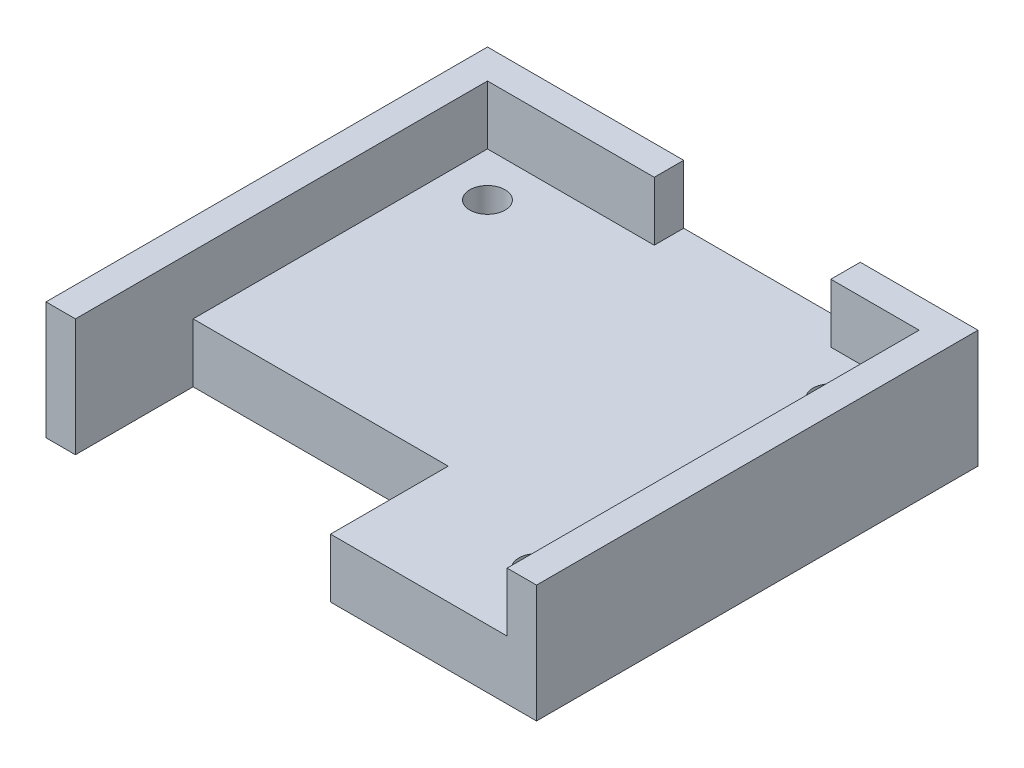
ISO-10303-21;
HEADER;
FILE_DESCRIPTION(('STEP AP214'),'2;1');
FILE_NAME('part.step','',(''),(''),'','','');
FILE_SCHEMA(('AUTOMOTIVE_DESIGN { 1 0 10303 214 1 1 1 1 }'));
ENDSEC;
DATA;
#1=APPLICATION_CONTEXT('core data for automotive mechanical design processes');
#2=APPLICATION_PROTOCOL_DEFINITION('international standard','automotive_design',2000,#1);
#3=PRODUCT_CONTEXT('',#1,'mechanical');
#4=PRODUCT('Part','Part','',(#3));
#5=PRODUCT_RELATED_PRODUCT_CATEGORY('part','',(#4));
#6=PRODUCT_DEFINITION_FORMATION('','',#4);
#7=PRODUCT_DEFINITION_CONTEXT('part definition',#1,'design');
#8=PRODUCT_DEFINITION('design','',#6,#7);
#9=PRODUCT_DEFINITION_SHAPE('','',#8);
#10=(LENGTH_UNIT() NAMED_UNIT(*) SI_UNIT(.MILLI.,.METRE.));
#11=(NAMED_UNIT(*) PLANE_ANGLE_UNIT() SI_UNIT($,.RADIAN.));
#12=(NAMED_UNIT(*) SI_UNIT($,.STERADIAN.) SOLID_ANGLE_UNIT());
#13=UNCERTAINTY_MEASURE_WITH_UNIT(LENGTH_MEASURE(1.E-05),#10,'distance_accuracy_value','');
#14=(GEOMETRIC_REPRESENTATION_CONTEXT(3) GLOBAL_UNCERTAINTY_ASSIGNED_CONTEXT((#13)) GLOBAL_UNIT_ASSIGNED_CONTEXT((#10,
#11,#12)) REPRESENTATION_CONTEXT('',''));
#15=CARTESIAN_POINT('',(0.,0.,0.));
#16=DIRECTION('',(0.,0.,1.));
#17=DIRECTION('',(1.,0.,0.));
#18=AXIS2_PLACEMENT_3D('',#15,#16,#17);
#19=CARTESIAN_POINT('',(-25.,12.,22.5));
#20=DIRECTION('',(0.,0.,-1.));
#21=DIRECTION('',(-1.,0.,0.));
#22=AXIS2_PLACEMENT_3D('',#19,#20,#21);
#23=PLANE('',#22);
#24=DIRECTION('',(1.,0.,0.));
#25=VECTOR('',#24,1.);
#26=CARTESIAN_POINT('',(-25.,0.,22.5));
#27=LINE('',#26,#25);
#28=CARTESIAN_POINT('',(-25.,0.,22.5));
#29=VERTEX_POINT('',#28);
#30=CARTESIAN_POINT('',(-22.,0.,22.5));
#31=VERTEX_POINT('',#30);
#32=EDGE_CURVE('E267',#29,#31,#27,.T.);
#33=ORIENTED_EDGE('',*,*,#32,.T.);
#34=DIRECTION('',(0.,-1.,0.));
#35=VECTOR('',#34,1.);
#36=CARTESIAN_POINT('',(-22.,12.,22.5));
#37=LINE('',#36,#35);
#38=CARTESIAN_POINT('',(-22.,12.,22.5));
#39=VERTEX_POINT('',#38);
#40=EDGE_CURVE('E174',#39,#31,#37,.T.);
#41=ORIENTED_EDGE('',*,*,#40,.F.);
#42=DIRECTION('',(1.,0.,0.));
#43=VECTOR('',#42,1.);
#44=CARTESIAN_POINT('',(-25.,12.,22.5));
#45=LINE('',#44,#43);
#46=CARTESIAN_POINT('',(-25.,12.,22.5));
#47=VERTEX_POINT('',#46);
#48=EDGE_CURVE('E274',#47,#39,#45,.T.);
#49=ORIENTED_EDGE('',*,*,#48,.F.);
#50=DIRECTION('',(0.,-1.,0.));
#51=VECTOR('',#50,1.);
#52=CARTESIAN_POINT('',(-25.,12.,22.5));
#53=LINE('',#52,#51);
#54=EDGE_CURVE('E289',#47,#29,#53,.T.);
#55=ORIENTED_EDGE('',*,*,#54,.T.);
#56=EDGE_LOOP('',(#33,#41,#49,#55));
#57=FACE_BOUND('',#56,.T.);
#58=ADVANCED_FACE('F34',(#57),#23,.F.);
#59=CARTESIAN_POINT('',(0.,12.,0.));
#60=DIRECTION('',(0.,1.,0.));
#61=DIRECTION('',(0.,0.,1.));
#62=AXIS2_PLACEMENT_3D('',#59,#60,#61);
#63=PLANE('',#62);
#64=ORIENTED_EDGE('',*,*,#48,.T.);
#65=DIRECTION('',(0.,0.,1.));
#66=VECTOR('',#65,1.);
#67=CARTESIAN_POINT('',(-22.,12.,-22.5));
#68=LINE('',#67,#66);
#69=CARTESIAN_POINT('',(-22.,12.,-19.5));
#70=VERTEX_POINT('',#69);
#71=EDGE_CURVE('E254',#70,#39,#68,.T.);
#72=ORIENTED_EDGE('',*,*,#71,.F.);
#73=DIRECTION('',(-1.,0.,0.));
#74=VECTOR('',#73,1.);
#75=CARTESIAN_POINT('',(-25.,12.,-19.5));
#76=LINE('',#75,#74);
#77=CARTESIAN_POINT('',(-4.99999999999999,12.,-19.5));
#78=VERTEX_POINT('',#77);
#79=EDGE_CURVE('E258',#78,#70,#76,.T.);
#80=ORIENTED_EDGE('',*,*,#79,.F.);
#81=DIRECTION('',(0.,0.,1.));
#82=VECTOR('',#81,1.);
#83=CARTESIAN_POINT('',(-4.99999999999999,12.,-29.5));
#84=LINE('',#83,#82);
#85=CARTESIAN_POINT('',(-4.99999999999999,12.,-22.5));
#86=VERTEX_POINT('',#85);
#87=EDGE_CURVE('E59',#86,#78,#84,.T.);
#88=ORIENTED_EDGE('',*,*,#87,.F.);
#89=DIRECTION('',(-1.,0.,0.));
#90=VECTOR('',#89,1.);
#91=CARTESIAN_POINT('',(-25.,12.,-22.5));
#92=LINE('',#91,#90);
#93=CARTESIAN_POINT('',(-25.,12.,-22.5));
#94=VERTEX_POINT('',#93);
#95=EDGE_CURVE('E266',#86,#94,#92,.T.);
#96=ORIENTED_EDGE('',*,*,#95,.T.);
#97=DIRECTION('',(0.,0.,1.));
#98=VECTOR('',#97,1.);
#99=CARTESIAN_POINT('',(-25.,12.,-22.5));
#100=LINE('',#99,#98);
#101=EDGE_CURVE('E271',#94,#47,#100,.T.);
#102=ORIENTED_EDGE('',*,*,#101,.T.);
#103=EDGE_LOOP('',(#64,#72,#80,#88,#96,#102));
#104=FACE_BOUND('',#103,.T.);
#105=ADVANCED_FACE('F317',(#104),#63,.T.);
#106=CARTESIAN_POINT('',(-25.,12.,-19.5));
#107=DIRECTION('',(0.,0.,1.));
#108=DIRECTION('',(1.,0.,0.));
#109=AXIS2_PLACEMENT_3D('',#106,#107,#108);
#110=PLANE('',#109);
#111=DIRECTION('',(0.,1.,0.));
#112=VECTOR('',#111,1.);
#113=CARTESIAN_POINT('',(13.,12.,-19.5));
#114=LINE('',#113,#112);
#115=CARTESIAN_POINT('',(13.,6.,-19.5));
#116=VERTEX_POINT('',#115);
#117=CARTESIAN_POINT('',(13.,12.,-19.5));
#118=VERTEX_POINT('',#117);
#119=EDGE_CURVE('E195',#116,#118,#114,.T.);
#120=ORIENTED_EDGE('',*,*,#119,.F.);
#121=DIRECTION('',(-1.,0.,0.));
#122=VECTOR('',#121,1.);
#123=CARTESIAN_POINT('',(-25.,6.,-19.5));
#124=LINE('',#123,#122);
#125=CARTESIAN_POINT('',(22.,6.,-19.5));
#126=VERTEX_POINT('',#125);
#127=EDGE_CURVE('E249',#126,#116,#124,.T.);
#128=ORIENTED_EDGE('',*,*,#127,.F.);
#129=DIRECTION('',(0.,-1.,0.));
#130=VECTOR('',#129,1.);
#131=CARTESIAN_POINT('',(22.,12.,-19.5));
#132=LINE('',#131,#130);
#133=CARTESIAN_POINT('',(22.,12.,-19.5));
#134=VERTEX_POINT('',#133);
#135=EDGE_CURVE('E244',#134,#126,#132,.T.);
#136=ORIENTED_EDGE('',*,*,#135,.F.);
#137=EDGE_CURVE('E259',#134,#118,#76,.T.);
#138=ORIENTED_EDGE('',*,*,#137,.T.);
#139=EDGE_LOOP('',(#120,#128,#136,#138));
#140=FACE_BOUND('',#139,.T.);
#141=ADVANCED_FACE('F324',(#140),#110,.T.);
#142=CARTESIAN_POINT('',(25.,12.,-22.5));
#143=DIRECTION('',(-1.,0.,0.));
#144=DIRECTION('',(0.,0.,1.));
#145=AXIS2_PLACEMENT_3D('',#142,#143,#144);
#146=PLANE('',#145);
#147=DIRECTION('',(0.,0.,-1.));
#148=VECTOR('',#147,1.);
#149=CARTESIAN_POINT('',(25.,0.,-22.5));
#150=LINE('',#149,#148);
#151=CARTESIAN_POINT('',(25.,0.,22.5));
#152=VERTEX_POINT('',#151);
#153=CARTESIAN_POINT('',(25.,0.,-22.5));
#154=VERTEX_POINT('',#153);
#155=EDGE_CURVE('E247',#152,#154,#150,.T.);
#156=ORIENTED_EDGE('',*,*,#155,.T.);
#157=DIRECTION('',(0.,-1.,0.));
#158=VECTOR('',#157,1.);
#159=CARTESIAN_POINT('',(25.,12.,-22.5));
#160=LINE('',#159,#158);
#161=CARTESIAN_POINT('',(25.,12.,-22.5));
#162=VERTEX_POINT('',#161);
#163=EDGE_CURVE('E11',#162,#154,#160,.T.);
#164=ORIENTED_EDGE('',*,*,#163,.F.);
#165=DIRECTION('',(0.,0.,-1.));
#166=VECTOR('',#165,1.);
#167=CARTESIAN_POINT('',(25.,12.,-22.5));
#168=LINE('',#167,#166);
#169=CARTESIAN_POINT('',(25.,12.,22.5));
#170=VERTEX_POINT('',#169);
#171=EDGE_CURVE('E263',#170,#162,#168,.T.);
#172=ORIENTED_EDGE('',*,*,#171,.F.);
#173=DIRECTION('',(0.,-1.,0.));
#174=VECTOR('',#173,1.);
#175=CARTESIAN_POINT('',(25.,12.,22.5));
#176=LINE('',#175,#174);
#177=EDGE_CURVE('E277',#170,#152,#176,.T.);
#178=ORIENTED_EDGE('',*,*,#177,.T.);
#179=EDGE_LOOP('',(#156,#164,#172,#178));
#180=FACE_BOUND('',#179,.T.);
#181=ADVANCED_FACE('F36',(#180),#146,.F.);
#182=CARTESIAN_POINT('',(-25.,12.,-22.5));
#183=DIRECTION('',(0.,0.,1.));
#184=DIRECTION('',(1.,0.,0.));
#185=AXIS2_PLACEMENT_3D('',#182,#183,#184);
#186=PLANE('',#185);
#187=DIRECTION('',(1.,0.,0.));
#188=VECTOR('',#187,1.);
#189=CARTESIAN_POINT('',(-25.,5.99999999999999,-22.5));
#190=LINE('',#189,#188);
#191=CARTESIAN_POINT('',(-4.99999999999999,6.,-22.5));
#192=VERTEX_POINT('',#191);
#193=CARTESIAN_POINT('',(13.,6.,-22.5));
#194=VERTEX_POINT('',#193);
#195=EDGE_CURVE('E200',#192,#194,#190,.T.);
#196=ORIENTED_EDGE('',*,*,#195,.T.);
#197=DIRECTION('',(0.,1.,0.));
#198=VECTOR('',#197,1.);
#199=CARTESIAN_POINT('',(13.,12.,-22.5));
#200=LINE('',#199,#198);
#201=CARTESIAN_POINT('',(13.,12.,-22.5));
#202=VERTEX_POINT('',#201);
#203=EDGE_CURVE('E197',#194,#202,#200,.T.);
#204=ORIENTED_EDGE('',*,*,#203,.T.);
#205=EDGE_CURVE('E268',#162,#202,#92,.T.);
#206=ORIENTED_EDGE('',*,*,#205,.F.);
#207=ORIENTED_EDGE('',*,*,#163,.T.);
#208=DIRECTION('',(-1.,0.,0.));
#209=VECTOR('',#208,1.);
#210=CARTESIAN_POINT('',(-25.,0.,-22.5));
#211=LINE('',#210,#209);
#212=CARTESIAN_POINT('',(-25.,0.,-22.5));
#213=VERTEX_POINT('',#212);
#214=EDGE_CURVE('E280',#154,#213,#211,.T.);
#215=ORIENTED_EDGE('',*,*,#214,.T.);
#216=DIRECTION('',(0.,-1.,0.));
#217=VECTOR('',#216,1.);
#218=CARTESIAN_POINT('',(-25.,12.,-22.5));
#219=LINE('',#218,#217);
#220=EDGE_CURVE('E43',#94,#213,#219,.T.);
#221=ORIENTED_EDGE('',*,*,#220,.F.);
#222=ORIENTED_EDGE('',*,*,#95,.F.);
#223=DIRECTION('',(0.,-1.,0.));
#224=VECTOR('',#223,1.);
#225=CARTESIAN_POINT('',(-4.99999999999999,12.,-22.5));
#226=LINE('',#225,#224);
#227=EDGE_CURVE('E192',#86,#192,#226,.T.);
#228=ORIENTED_EDGE('',*,*,#227,.T.);
#229=EDGE_LOOP('',(#196,#204,#206,#207,#215,#221,#222,#228));
#230=FACE_BOUND('',#229,.T.);
#231=ADVANCED_FACE('F338',(#230),#186,.F.);
#232=CARTESIAN_POINT('',(-25.,12.,-22.5));
#233=DIRECTION('',(1.,0.,0.));
#234=DIRECTION('',(0.,0.,-1.));
#235=AXIS2_PLACEMENT_3D('',#232,#233,#234);
#236=PLANE('',#235);
#237=DIRECTION('',(0.,0.,1.));
#238=VECTOR('',#237,1.);
#239=CARTESIAN_POINT('',(-25.,0.,-22.5));
#240=LINE('',#239,#238);
#241=EDGE_CURVE('E282',#213,#29,#240,.T.);
#242=ORIENTED_EDGE('',*,*,#241,.T.);
#243=ORIENTED_EDGE('',*,*,#54,.F.);
#244=ORIENTED_EDGE('',*,*,#101,.F.);
#245=ORIENTED_EDGE('',*,*,#220,.T.);
#246=EDGE_LOOP('',(#242,#243,#244,#245));
#247=FACE_BOUND('',#246,.T.);
#248=ADVANCED_FACE('F330',(#247),#236,.F.);
#249=DIRECTION('',(1.,0.,0.));
#250=VECTOR('',#249,1.);
#251=CARTESIAN_POINT('',(-22.,6.,22.5));
#252=LINE('',#251,#250);
#253=CARTESIAN_POINT('',(4.,6.,22.5));
#254=VERTEX_POINT('',#253);
#255=CARTESIAN_POINT('',(22.,6.,22.5));
#256=VERTEX_POINT('',#255);
#257=EDGE_CURVE('E176',#254,#256,#252,.T.);
#258=ORIENTED_EDGE('',*,*,#257,.F.);
#259=DIRECTION('',(0.,1.,0.));
#260=VECTOR('',#259,1.);
#261=CARTESIAN_POINT('',(4.,-6.,22.5));
#262=LINE('',#261,#260);
#263=CARTESIAN_POINT('',(4.,0.,22.5));
#264=VERTEX_POINT('',#263);
#265=EDGE_CURVE('E51',#264,#254,#262,.T.);
#266=ORIENTED_EDGE('',*,*,#265,.F.);
#267=EDGE_CURVE('E284',#264,#152,#27,.T.);
#268=ORIENTED_EDGE('',*,*,#267,.T.);
#269=ORIENTED_EDGE('',*,*,#177,.F.);
#270=CARTESIAN_POINT('',(22.,12.,22.5));
#271=VERTEX_POINT('',#270);
#272=EDGE_CURVE('E273',#271,#170,#45,.T.);
#273=ORIENTED_EDGE('',*,*,#272,.F.);
#274=DIRECTION('',(0.,1.,0.));
#275=VECTOR('',#274,1.);
#276=CARTESIAN_POINT('',(22.,12.,22.5));
#277=LINE('',#276,#275);
#278=EDGE_CURVE('E178',#256,#271,#277,.T.);
#279=ORIENTED_EDGE('',*,*,#278,.F.);
#280=EDGE_LOOP('',(#258,#266,#268,#269,#273,#279));
#281=FACE_BOUND('',#280,.T.);
#282=ADVANCED_FACE('F320',(#281),#23,.F.);
#283=DIRECTION('',(0.,0.,-1.));
#284=VECTOR('',#283,1.);
#285=CARTESIAN_POINT('',(22.,12.,-22.5));
#286=LINE('',#285,#284);
#287=EDGE_CURVE('E256',#271,#134,#286,.T.);
#288=ORIENTED_EDGE('',*,*,#287,.F.);
#289=ORIENTED_EDGE('',*,*,#272,.T.);
#290=ORIENTED_EDGE('',*,*,#171,.T.);
#291=ORIENTED_EDGE('',*,*,#205,.T.);
#292=DIRECTION('',(0.,0.,1.));
#293=VECTOR('',#292,1.);
#294=CARTESIAN_POINT('',(13.,12.,-29.5));
#295=LINE('',#294,#293);
#296=EDGE_CURVE('E181',#202,#118,#295,.T.);
#297=ORIENTED_EDGE('',*,*,#296,.T.);
#298=ORIENTED_EDGE('',*,*,#137,.F.);
#299=EDGE_LOOP('',(#288,#289,#290,#291,#297,#298));
#300=FACE_BOUND('',#299,.T.);
#301=ADVANCED_FACE('F326',(#300),#63,.T.);
#302=CARTESIAN_POINT('',(0.,0.,0.));
#303=DIRECTION('',(0.,1.,0.));
#304=DIRECTION('',(0.,0.,1.));
#305=AXIS2_PLACEMENT_3D('',#302,#303,#304);
#306=PLANE('',#305);
#307=CARTESIAN_POINT('',(17.5,0.,15.));
#308=DIRECTION('',(0.,-1.,0.));
#309=DIRECTION('',(0.,0.,-1.));
#310=AXIS2_PLACEMENT_3D('',#307,#308,#309);
#311=CIRCLE('',#310,3.025);
#312=CARTESIAN_POINT('',(17.5,0.,11.975));
#313=VERTEX_POINT('',#312);
#314=EDGE_CURVE('E203',#313,#313,#311,.T.);
#315=ORIENTED_EDGE('',*,*,#314,.F.);
#316=EDGE_LOOP('',(#315));
#317=FACE_BOUND('',#316,.T.);
#318=CARTESIAN_POINT('',(17.5,0.,-15.));
#319=DIRECTION('',(0.,-1.,0.));
#320=DIRECTION('',(0.,0.,-1.));
#321=AXIS2_PLACEMENT_3D('',#318,#319,#320);
#322=CIRCLE('',#321,3.025);
#323=CARTESIAN_POINT('',(17.5,0.,-18.025));
#324=VERTEX_POINT('',#323);
#325=EDGE_CURVE('E215',#324,#324,#322,.T.);
#326=ORIENTED_EDGE('',*,*,#325,.F.);
#327=EDGE_LOOP('',(#326));
#328=FACE_BOUND('',#327,.T.);
#329=CARTESIAN_POINT('',(-17.5,0.,-15.));
#330=DIRECTION('',(0.,-1.,0.));
#331=DIRECTION('',(0.,0.,-1.));
#332=AXIS2_PLACEMENT_3D('',#329,#330,#331);
#333=CIRCLE('',#332,3.025);
#334=CARTESIAN_POINT('',(-17.5,0.,-18.025));
#335=VERTEX_POINT('',#334);
#336=EDGE_CURVE('E228',#335,#335,#333,.T.);
#337=ORIENTED_EDGE('',*,*,#336,.F.);
#338=EDGE_LOOP('',(#337));
#339=FACE_BOUND('',#338,.T.);
#340=DIRECTION('',(-1.,0.,0.));
#341=VECTOR('',#340,1.);
#342=CARTESIAN_POINT('',(0.,0.,10.5));
#343=LINE('',#342,#341);
#344=CARTESIAN_POINT('',(4.,0.,10.5));
#345=VERTEX_POINT('',#344);
#346=CARTESIAN_POINT('',(-22.,0.,10.5));
#347=VERTEX_POINT('',#346);
#348=EDGE_CURVE('E151',#345,#347,#343,.T.);
#349=ORIENTED_EDGE('',*,*,#348,.T.);
#350=DIRECTION('',(0.,0.,1.));
#351=VECTOR('',#350,1.);
#352=CARTESIAN_POINT('',(-22.,0.,0.));
#353=LINE('',#352,#351);
#354=EDGE_CURVE('E171',#347,#31,#353,.T.);
#355=ORIENTED_EDGE('',*,*,#354,.T.);
#356=ORIENTED_EDGE('',*,*,#32,.F.);
#357=ORIENTED_EDGE('',*,*,#241,.F.);
#358=ORIENTED_EDGE('',*,*,#214,.F.);
#359=ORIENTED_EDGE('',*,*,#155,.F.);
#360=ORIENTED_EDGE('',*,*,#267,.F.);
#361=DIRECTION('',(0.,0.,-1.));
#362=VECTOR('',#361,1.);
#363=CARTESIAN_POINT('',(4.,0.,0.));
#364=LINE('',#363,#362);
#365=EDGE_CURVE('E167',#264,#345,#364,.T.);
#366=ORIENTED_EDGE('',*,*,#365,.T.);
#367=EDGE_LOOP('',(#349,#355,#356,#357,#358,#359,#360,#366));
#368=FACE_BOUND('',#367,.T.);
#369=ADVANCED_FACE('F336',(#317,#328,#339,#368),#306,.F.);
#370=CARTESIAN_POINT('',(22.,12.,-22.5));
#371=DIRECTION('',(-1.,0.,0.));
#372=DIRECTION('',(0.,0.,1.));
#373=AXIS2_PLACEMENT_3D('',#370,#371,#372);
#374=PLANE('',#373);
#375=ORIENTED_EDGE('',*,*,#287,.T.);
#376=ORIENTED_EDGE('',*,*,#135,.T.);
#377=DIRECTION('',(0.,0.,-1.));
#378=VECTOR('',#377,1.);
#379=CARTESIAN_POINT('',(22.,6.,-22.5));
#380=LINE('',#379,#378);
#381=EDGE_CURVE('E241',#256,#126,#380,.T.);
#382=ORIENTED_EDGE('',*,*,#381,.F.);
#383=ORIENTED_EDGE('',*,*,#278,.T.);
#384=EDGE_LOOP('',(#375,#376,#382,#383));
#385=FACE_BOUND('',#384,.T.);
#386=ADVANCED_FACE('F346',(#385),#374,.T.);
#387=DIRECTION('',(0.,-1.,0.));
#388=VECTOR('',#387,1.);
#389=CARTESIAN_POINT('',(-4.99999999999999,12.,-19.5));
#390=LINE('',#389,#388);
#391=CARTESIAN_POINT('',(-4.99999999999999,6.,-19.5));
#392=VERTEX_POINT('',#391);
#393=EDGE_CURVE('E184',#78,#392,#390,.T.);
#394=ORIENTED_EDGE('',*,*,#393,.F.);
#395=ORIENTED_EDGE('',*,*,#79,.T.);
#396=DIRECTION('',(0.,-1.,0.));
#397=VECTOR('',#396,1.);
#398=CARTESIAN_POINT('',(-22.,12.,-19.5));
#399=LINE('',#398,#397);
#400=CARTESIAN_POINT('',(-22.,6.,-19.5));
#401=VERTEX_POINT('',#400);
#402=EDGE_CURVE('E248',#70,#401,#399,.T.);
#403=ORIENTED_EDGE('',*,*,#402,.T.);
#404=EDGE_CURVE('E243',#392,#401,#124,.T.);
#405=ORIENTED_EDGE('',*,*,#404,.F.);
#406=EDGE_LOOP('',(#394,#395,#403,#405));
#407=FACE_BOUND('',#406,.T.);
#408=ADVANCED_FACE('F312',(#407),#110,.T.);
#409=CARTESIAN_POINT('',(-22.,12.,-22.5));
#410=DIRECTION('',(1.,0.,0.));
#411=DIRECTION('',(0.,0.,-1.));
#412=AXIS2_PLACEMENT_3D('',#409,#410,#411);
#413=PLANE('',#412);
#414=ORIENTED_EDGE('',*,*,#40,.T.);
#415=ORIENTED_EDGE('',*,*,#354,.F.);
#416=DIRECTION('',(0.,1.,0.));
#417=VECTOR('',#416,1.);
#418=CARTESIAN_POINT('',(-22.,-6.,10.5));
#419=LINE('',#418,#417);
#420=CARTESIAN_POINT('',(-22.,6.,10.5));
#421=VERTEX_POINT('',#420);
#422=EDGE_CURVE('E153',#347,#421,#419,.T.);
#423=ORIENTED_EDGE('',*,*,#422,.T.);
#424=DIRECTION('',(0.,0.,1.));
#425=VECTOR('',#424,1.);
#426=CARTESIAN_POINT('',(-22.,6.,-22.5));
#427=LINE('',#426,#425);
#428=EDGE_CURVE('E163',#401,#421,#427,.T.);
#429=ORIENTED_EDGE('',*,*,#428,.F.);
#430=ORIENTED_EDGE('',*,*,#402,.F.);
#431=ORIENTED_EDGE('',*,*,#71,.T.);
#432=EDGE_LOOP('',(#414,#415,#423,#429,#430,#431));
#433=FACE_BOUND('',#432,.T.);
#434=ADVANCED_FACE('F303',(#433),#413,.T.);
#435=CARTESIAN_POINT('',(0.,6.,0.));
#436=DIRECTION('',(0.,1.,0.));
#437=DIRECTION('',(0.,0.,1.));
#438=AXIS2_PLACEMENT_3D('',#435,#436,#437);
#439=PLANE('',#438);
#440=DIRECTION('',(-1.,0.,0.));
#441=VECTOR('',#440,1.);
#442=CARTESIAN_POINT('',(-22.,6.,10.5));
#443=LINE('',#442,#441);
#444=CARTESIAN_POINT('',(4.,6.,10.5));
#445=VERTEX_POINT('',#444);
#446=EDGE_CURVE('E148',#445,#421,#443,.T.);
#447=ORIENTED_EDGE('',*,*,#446,.F.);
#448=DIRECTION('',(0.,0.,-1.));
#449=VECTOR('',#448,1.);
#450=CARTESIAN_POINT('',(4.,6.,22.5));
#451=LINE('',#450,#449);
#452=EDGE_CURVE('E155',#254,#445,#451,.T.);
#453=ORIENTED_EDGE('',*,*,#452,.F.);
#454=ORIENTED_EDGE('',*,*,#257,.T.);
#455=ORIENTED_EDGE('',*,*,#381,.T.);
#456=ORIENTED_EDGE('',*,*,#127,.T.);
#457=DIRECTION('',(0.,0.,1.));
#458=VECTOR('',#457,1.);
#459=CARTESIAN_POINT('',(13.,6.,-29.5));
#460=LINE('',#459,#458);
#461=EDGE_CURVE('E182',#194,#116,#460,.T.);
#462=ORIENTED_EDGE('',*,*,#461,.F.);
#463=ORIENTED_EDGE('',*,*,#195,.F.);
#464=DIRECTION('',(0.,0.,1.));
#465=VECTOR('',#464,1.);
#466=CARTESIAN_POINT('',(-4.99999999999999,6.,-29.5));
#467=LINE('',#466,#465);
#468=EDGE_CURVE('E185',#192,#392,#467,.T.);
#469=ORIENTED_EDGE('',*,*,#468,.T.);
#470=ORIENTED_EDGE('',*,*,#404,.T.);
#471=ORIENTED_EDGE('',*,*,#428,.T.);
#472=EDGE_LOOP('',(#447,#453,#454,#455,#456,#462,#463,#469,#470,#471));
#473=FACE_BOUND('',#472,.T.);
#474=CARTESIAN_POINT('',(17.5,6.,15.));
#475=DIRECTION('',(0.,1.,0.));
#476=DIRECTION('',(0.,0.,1.));
#477=AXIS2_PLACEMENT_3D('',#474,#475,#476);
#478=CIRCLE('',#477,1.8);
#479=CARTESIAN_POINT('',(17.5,6.,16.8));
#480=VERTEX_POINT('',#479);
#481=EDGE_CURVE('E38',#480,#480,#478,.T.);
#482=ORIENTED_EDGE('',*,*,#481,.F.);
#483=EDGE_LOOP('',(#482));
#484=FACE_BOUND('',#483,.T.);
#485=CARTESIAN_POINT('',(-17.5,6.,-15.));
#486=DIRECTION('',(0.,1.,0.));
#487=DIRECTION('',(0.,0.,1.));
#488=AXIS2_PLACEMENT_3D('',#485,#486,#487);
#489=CIRCLE('',#488,1.8);
#490=CARTESIAN_POINT('',(-17.5,6.,-13.2));
#491=VERTEX_POINT('',#490);
#492=EDGE_CURVE('E240',#491,#491,#489,.T.);
#493=ORIENTED_EDGE('',*,*,#492,.F.);
#494=EDGE_LOOP('',(#493));
#495=FACE_BOUND('',#494,.T.);
#496=CARTESIAN_POINT('',(17.5,6.,-15.));
#497=DIRECTION('',(0.,1.,0.));
#498=DIRECTION('',(0.,0.,1.));
#499=AXIS2_PLACEMENT_3D('',#496,#497,#498);
#500=CIRCLE('',#499,1.8);
#501=CARTESIAN_POINT('',(17.5,6.,-13.2));
#502=VERTEX_POINT('',#501);
#503=EDGE_CURVE('E227',#502,#502,#500,.T.);
#504=ORIENTED_EDGE('',*,*,#503,.F.);
#505=EDGE_LOOP('',(#504));
#506=FACE_BOUND('',#505,.T.);
#507=ADVANCED_FACE('F160',(#473,#484,#495,#506),#439,.T.);
#508=CARTESIAN_POINT('',(-17.5,0.,-15.));
#509=DIRECTION('',(0.,-1.,0.));
#510=DIRECTION('',(0.,0.,-1.));
#511=AXIS2_PLACEMENT_3D('',#508,#509,#510);
#512=CYLINDRICAL_SURFACE('',#511,1.8);
#513=ORIENTED_EDGE('',*,*,#492,.T.);
#514=EDGE_LOOP('',(#513));
#515=FACE_BOUND('',#514,.T.);
#516=CARTESIAN_POINT('',(-17.5,3.4,-15.));
#517=DIRECTION('',(0.,-1.,0.));
#518=DIRECTION('',(0.,0.,-1.));
#519=AXIS2_PLACEMENT_3D('',#516,#517,#518);
#520=CIRCLE('',#519,1.8);
#521=CARTESIAN_POINT('',(-17.5,3.4,-16.8));
#522=VERTEX_POINT('',#521);
#523=EDGE_CURVE('E237',#522,#522,#520,.T.);
#524=ORIENTED_EDGE('',*,*,#523,.T.);
#525=EDGE_LOOP('',(#524));
#526=FACE_BOUND('',#525,.T.);
#527=ADVANCED_FACE('F302',(#515,#526),#512,.F.);
#528=CARTESIAN_POINT('',(-14.5,3.4,-15.));
#529=DIRECTION('',(0.,1.,0.));
#530=DIRECTION('',(0.,0.,1.));
#531=AXIS2_PLACEMENT_3D('',#528,#529,#530);
#532=PLANE('',#531);
#533=ORIENTED_EDGE('',*,*,#523,.F.);
#534=EDGE_LOOP('',(#533));
#535=FACE_BOUND('',#534,.T.);
#536=CARTESIAN_POINT('',(-17.5,3.4,-15.));
#537=DIRECTION('',(0.,-1.,0.));
#538=DIRECTION('',(0.,0.,-1.));
#539=AXIS2_PLACEMENT_3D('',#536,#537,#538);
#540=CIRCLE('',#539,3.);
#541=CARTESIAN_POINT('',(-17.5,3.4,-18.));
#542=VERTEX_POINT('',#541);
#543=EDGE_CURVE('E234',#542,#542,#540,.T.);
#544=ORIENTED_EDGE('',*,*,#543,.T.);
#545=EDGE_LOOP('',(#544));
#546=FACE_BOUND('',#545,.T.);
#547=ADVANCED_FACE('F309',(#535,#546),#532,.F.);
#548=CARTESIAN_POINT('',(-17.5,0.,-15.));
#549=DIRECTION('',(0.,-1.,0.));
#550=DIRECTION('',(0.,0.,-1.));
#551=AXIS2_PLACEMENT_3D('',#548,#549,#550);
#552=CYLINDRICAL_SURFACE('',#551,3.);
#553=ORIENTED_EDGE('',*,*,#543,.F.);
#554=EDGE_LOOP('',(#553));
#555=FACE_BOUND('',#554,.T.);
#556=CARTESIAN_POINT('',(-17.5,0.0249999999999992,-15.));
#557=DIRECTION('',(0.,-1.,0.));
#558=DIRECTION('',(0.,0.,-1.));
#559=AXIS2_PLACEMENT_3D('',#556,#557,#558);
#560=CIRCLE('',#559,3.);
#561=CARTESIAN_POINT('',(-17.5,0.0249999999999992,-18.));
#562=VERTEX_POINT('',#561);
#563=EDGE_CURVE('E231',#562,#562,#560,.T.);
#564=ORIENTED_EDGE('',*,*,#563,.T.);
#565=EDGE_LOOP('',(#564));
#566=FACE_BOUND('',#565,.T.);
#567=ADVANCED_FACE('F396',(#555,#566),#552,.F.);
#568=CARTESIAN_POINT('',(-17.5,0.,-15.));
#569=DIRECTION('',(0.,-1.,0.));
#570=DIRECTION('',(0.,0.,-1.));
#571=AXIS2_PLACEMENT_3D('',#568,#569,#570);
#572=CONICAL_SURFACE('',#571,3.025,0.78539816339747);
#573=ORIENTED_EDGE('',*,*,#563,.F.);
#574=EDGE_LOOP('',(#573));
#575=FACE_BOUND('',#574,.T.);
#576=ORIENTED_EDGE('',*,*,#336,.T.);
#577=EDGE_LOOP('',(#576));
#578=FACE_BOUND('',#577,.T.);
#579=ADVANCED_FACE('F400',(#575,#578),#572,.F.);
#580=CARTESIAN_POINT('',(17.5,0.,-15.));
#581=DIRECTION('',(0.,-1.,0.));
#582=DIRECTION('',(0.,0.,-1.));
#583=AXIS2_PLACEMENT_3D('',#580,#581,#582);
#584=CYLINDRICAL_SURFACE('',#583,1.8);
#585=ORIENTED_EDGE('',*,*,#503,.T.);
#586=EDGE_LOOP('',(#585));
#587=FACE_BOUND('',#586,.T.);
#588=CARTESIAN_POINT('',(17.5,3.4,-15.));
#589=DIRECTION('',(0.,-1.,0.));
#590=DIRECTION('',(0.,0.,-1.));
#591=AXIS2_PLACEMENT_3D('',#588,#589,#590);
#592=CIRCLE('',#591,1.8);
#593=CARTESIAN_POINT('',(17.5,3.4,-16.8));
#594=VERTEX_POINT('',#593);
#595=EDGE_CURVE('E224',#594,#594,#592,.T.);
#596=ORIENTED_EDGE('',*,*,#595,.T.);
#597=EDGE_LOOP('',(#596));
#598=FACE_BOUND('',#597,.T.);
#599=ADVANCED_FACE('F298',(#587,#598),#584,.F.);
#600=CARTESIAN_POINT('',(20.5,3.4,-15.));
#601=DIRECTION('',(0.,1.,0.));
#602=DIRECTION('',(0.,0.,1.));
#603=AXIS2_PLACEMENT_3D('',#600,#601,#602);
#604=PLANE('',#603);
#605=ORIENTED_EDGE('',*,*,#595,.F.);
#606=EDGE_LOOP('',(#605));
#607=FACE_BOUND('',#606,.T.);
#608=CARTESIAN_POINT('',(17.5,3.4,-15.));
#609=DIRECTION('',(0.,-1.,0.));
#610=DIRECTION('',(0.,0.,-1.));
#611=AXIS2_PLACEMENT_3D('',#608,#609,#610);
#612=CIRCLE('',#611,3.);
#613=CARTESIAN_POINT('',(17.5,3.4,-18.));
#614=VERTEX_POINT('',#613);
#615=EDGE_CURVE('E221',#614,#614,#612,.T.);
#616=ORIENTED_EDGE('',*,*,#615,.T.);
#617=EDGE_LOOP('',(#616));
#618=FACE_BOUND('',#617,.T.);
#619=ADVANCED_FACE('F407',(#607,#618),#604,.F.);
#620=CARTESIAN_POINT('',(17.5,0.,-15.));
#621=DIRECTION('',(0.,-1.,0.));
#622=DIRECTION('',(0.,0.,-1.));
#623=AXIS2_PLACEMENT_3D('',#620,#621,#622);
#624=CYLINDRICAL_SURFACE('',#623,3.);
#625=ORIENTED_EDGE('',*,*,#615,.F.);
#626=EDGE_LOOP('',(#625));
#627=FACE_BOUND('',#626,.T.);
#628=CARTESIAN_POINT('',(17.5,0.0249999999999996,-15.));
#629=DIRECTION('',(0.,-1.,0.));
#630=DIRECTION('',(0.,0.,-1.));
#631=AXIS2_PLACEMENT_3D('',#628,#629,#630);
#632=CIRCLE('',#631,3.);
#633=CARTESIAN_POINT('',(17.5,0.0249999999999996,-18.));
#634=VERTEX_POINT('',#633);
#635=EDGE_CURVE('E218',#634,#634,#632,.T.);
#636=ORIENTED_EDGE('',*,*,#635,.T.);
#637=EDGE_LOOP('',(#636));
#638=FACE_BOUND('',#637,.T.);
#639=ADVANCED_FACE('F410',(#627,#638),#624,.F.);
#640=CARTESIAN_POINT('',(17.5,0.,-15.));
#641=DIRECTION('',(0.,-1.,0.));
#642=DIRECTION('',(0.,0.,-1.));
#643=AXIS2_PLACEMENT_3D('',#640,#641,#642);
#644=CONICAL_SURFACE('',#643,3.025,0.78539816339747);
#645=ORIENTED_EDGE('',*,*,#635,.F.);
#646=EDGE_LOOP('',(#645));
#647=FACE_BOUND('',#646,.T.);
#648=ORIENTED_EDGE('',*,*,#325,.T.);
#649=EDGE_LOOP('',(#648));
#650=FACE_BOUND('',#649,.T.);
#651=ADVANCED_FACE('F414',(#647,#650),#644,.F.);
#652=CARTESIAN_POINT('',(17.5,0.,15.));
#653=DIRECTION('',(0.,-1.,0.));
#654=DIRECTION('',(0.,0.,-1.));
#655=AXIS2_PLACEMENT_3D('',#652,#653,#654);
#656=CYLINDRICAL_SURFACE('',#655,1.8);
#657=ORIENTED_EDGE('',*,*,#481,.T.);
#658=EDGE_LOOP('',(#657));
#659=FACE_BOUND('',#658,.T.);
#660=CARTESIAN_POINT('',(17.5,3.4,15.));
#661=DIRECTION('',(0.,-1.,0.));
#662=DIRECTION('',(0.,0.,-1.));
#663=AXIS2_PLACEMENT_3D('',#660,#661,#662);
#664=CIRCLE('',#663,1.8);
#665=CARTESIAN_POINT('',(17.5,3.4,13.2));
#666=VERTEX_POINT('',#665);
#667=EDGE_CURVE('E212',#666,#666,#664,.T.);
#668=ORIENTED_EDGE('',*,*,#667,.T.);
#669=EDGE_LOOP('',(#668));
#670=FACE_BOUND('',#669,.T.);
#671=ADVANCED_FACE('F418',(#659,#670),#656,.F.);
#672=CARTESIAN_POINT('',(20.5,3.4,15.));
#673=DIRECTION('',(0.,1.,0.));
#674=DIRECTION('',(0.,0.,1.));
#675=AXIS2_PLACEMENT_3D('',#672,#673,#674);
#676=PLANE('',#675);
#677=ORIENTED_EDGE('',*,*,#667,.F.);
#678=EDGE_LOOP('',(#677));
#679=FACE_BOUND('',#678,.T.);
#680=CARTESIAN_POINT('',(17.5,3.4,15.));
#681=DIRECTION('',(0.,-1.,0.));
#682=DIRECTION('',(0.,0.,-1.));
#683=AXIS2_PLACEMENT_3D('',#680,#681,#682);
#684=CIRCLE('',#683,3.);
#685=CARTESIAN_POINT('',(17.5,3.4,12.));
#686=VERTEX_POINT('',#685);
#687=EDGE_CURVE('E209',#686,#686,#684,.T.);
#688=ORIENTED_EDGE('',*,*,#687,.T.);
#689=EDGE_LOOP('',(#688));
#690=FACE_BOUND('',#689,.T.);
#691=ADVANCED_FACE('F422',(#679,#690),#676,.F.);
#692=CARTESIAN_POINT('',(17.5,0.,15.));
#693=DIRECTION('',(0.,-1.,0.));
#694=DIRECTION('',(0.,0.,-1.));
#695=AXIS2_PLACEMENT_3D('',#692,#693,#694);
#696=CYLINDRICAL_SURFACE('',#695,3.);
#697=ORIENTED_EDGE('',*,*,#687,.F.);
#698=EDGE_LOOP('',(#697));
#699=FACE_BOUND('',#698,.T.);
#700=CARTESIAN_POINT('',(17.5,0.0249999999999996,15.));
#701=DIRECTION('',(0.,-1.,0.));
#702=DIRECTION('',(0.,0.,-1.));
#703=AXIS2_PLACEMENT_3D('',#700,#701,#702);
#704=CIRCLE('',#703,3.);
#705=CARTESIAN_POINT('',(17.5,0.0249999999999996,12.));
#706=VERTEX_POINT('',#705);
#707=EDGE_CURVE('E206',#706,#706,#704,.T.);
#708=ORIENTED_EDGE('',*,*,#707,.T.);
#709=EDGE_LOOP('',(#708));
#710=FACE_BOUND('',#709,.T.);
#711=ADVANCED_FACE('F426',(#699,#710),#696,.F.);
#712=CARTESIAN_POINT('',(17.5,0.,15.));
#713=DIRECTION('',(0.,-1.,0.));
#714=DIRECTION('',(0.,0.,-1.));
#715=AXIS2_PLACEMENT_3D('',#712,#713,#714);
#716=CONICAL_SURFACE('',#715,3.025,0.78539816339747);
#717=ORIENTED_EDGE('',*,*,#707,.F.);
#718=EDGE_LOOP('',(#717));
#719=FACE_BOUND('',#718,.T.);
#720=ORIENTED_EDGE('',*,*,#314,.T.);
#721=EDGE_LOOP('',(#720));
#722=FACE_BOUND('',#721,.T.);
#723=ADVANCED_FACE('F430',(#719,#722),#716,.F.);
#724=CARTESIAN_POINT('',(13.,12.,-29.5));
#725=DIRECTION('',(1.,0.,0.));
#726=DIRECTION('',(0.,1.,0.));
#727=AXIS2_PLACEMENT_3D('',#724,#725,#726);
#728=PLANE('',#727);
#729=ORIENTED_EDGE('',*,*,#461,.T.);
#730=ORIENTED_EDGE('',*,*,#119,.T.);
#731=ORIENTED_EDGE('',*,*,#296,.F.);
#732=ORIENTED_EDGE('',*,*,#203,.F.);
#733=EDGE_LOOP('',(#729,#730,#731,#732));
#734=FACE_BOUND('',#733,.T.);
#735=ADVANCED_FACE('F352',(#734),#728,.F.);
#736=CARTESIAN_POINT('',(-4.99999999999999,12.,-29.5));
#737=DIRECTION('',(-1.,0.,0.));
#738=DIRECTION('',(0.,-1.,0.));
#739=AXIS2_PLACEMENT_3D('',#736,#737,#738);
#740=PLANE('',#739);
#741=ORIENTED_EDGE('',*,*,#87,.T.);
#742=ORIENTED_EDGE('',*,*,#393,.T.);
#743=ORIENTED_EDGE('',*,*,#468,.F.);
#744=ORIENTED_EDGE('',*,*,#227,.F.);
#745=EDGE_LOOP('',(#741,#742,#743,#744));
#746=FACE_BOUND('',#745,.T.);
#747=ADVANCED_FACE('F358',(#746),#740,.F.);
#748=CARTESIAN_POINT('',(-22.,-6.,10.5));
#749=DIRECTION('',(0.,0.,-1.));
#750=DIRECTION('',(-1.,0.,0.));
#751=AXIS2_PLACEMENT_3D('',#748,#749,#750);
#752=PLANE('',#751);
#753=DIRECTION('',(0.,1.,0.));
#754=VECTOR('',#753,1.);
#755=CARTESIAN_POINT('',(4.,-6.,10.5));
#756=LINE('',#755,#754);
#757=EDGE_CURVE('E144',#345,#445,#756,.T.);
#758=ORIENTED_EDGE('',*,*,#757,.T.);
#759=ORIENTED_EDGE('',*,*,#446,.T.);
#760=ORIENTED_EDGE('',*,*,#422,.F.);
#761=ORIENTED_EDGE('',*,*,#348,.F.);
#762=EDGE_LOOP('',(#758,#759,#760,#761));
#763=FACE_BOUND('',#762,.T.);
#764=ADVANCED_FACE('F145',(#763),#752,.F.);
#765=CARTESIAN_POINT('',(4.,-6.,22.5));
#766=DIRECTION('',(1.,0.,0.));
#767=DIRECTION('',(0.,0.,-1.));
#768=AXIS2_PLACEMENT_3D('',#765,#766,#767);
#769=PLANE('',#768);
#770=ORIENTED_EDGE('',*,*,#265,.T.);
#771=ORIENTED_EDGE('',*,*,#452,.T.);
#772=ORIENTED_EDGE('',*,*,#757,.F.);
#773=ORIENTED_EDGE('',*,*,#365,.F.);
#774=EDGE_LOOP('',(#770,#771,#772,#773));
#775=FACE_BOUND('',#774,.T.);
#776=ADVANCED_FACE('F156',(#775),#769,.F.);
#777=CLOSED_SHELL('',(#58,#105,#141,#181,#231,#248,#282,#301,#369,#386,#408,#434,#507,#527,#547,
#567,#579,#599,#619,#639,#651,#671,#691,#711,#723,#735,#747,#764,#776));
#778=MANIFOLD_SOLID_BREP('B2',#777);
#779=ADVANCED_BREP_SHAPE_REPRESENTATION('',(#18,#778),#14);
#780=SHAPE_DEFINITION_REPRESENTATION(#9,#779);
ENDSEC;
END-ISO-10303-21;
